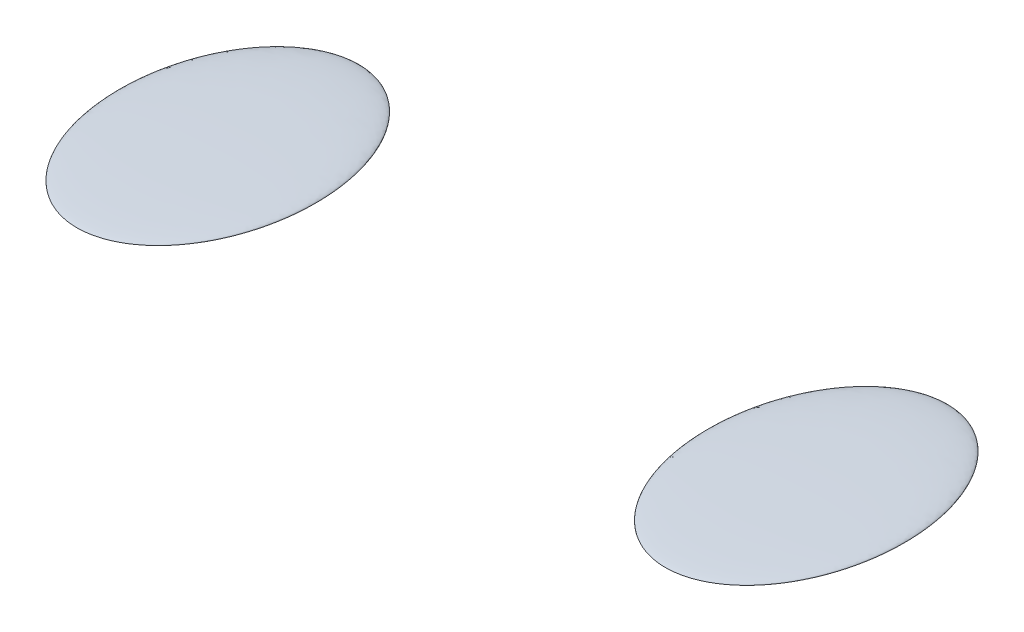
ISO-10303-21;
HEADER;
FILE_DESCRIPTION(('STEP AP214'),'2;1');
FILE_NAME('part.step','',(''),(''),'','','');
FILE_SCHEMA(('AUTOMOTIVE_DESIGN { 1 0 10303 214 1 1 1 1 }'));
ENDSEC;
DATA;
#1=APPLICATION_CONTEXT('core data for automotive mechanical design processes');
#2=APPLICATION_PROTOCOL_DEFINITION('international standard','automotive_design',2000,#1);
#3=PRODUCT_CONTEXT('',#1,'mechanical');
#4=PRODUCT('Part','Part','',(#3));
#5=PRODUCT_RELATED_PRODUCT_CATEGORY('part','',(#4));
#6=PRODUCT_DEFINITION_FORMATION('','',#4);
#7=PRODUCT_DEFINITION_CONTEXT('part definition',#1,'design');
#8=PRODUCT_DEFINITION('design','',#6,#7);
#9=PRODUCT_DEFINITION_SHAPE('','',#8);
#10=(LENGTH_UNIT() NAMED_UNIT(*) SI_UNIT(.MILLI.,.METRE.));
#11=(NAMED_UNIT(*) PLANE_ANGLE_UNIT() SI_UNIT($,.RADIAN.));
#12=(NAMED_UNIT(*) SI_UNIT($,.STERADIAN.) SOLID_ANGLE_UNIT());
#13=UNCERTAINTY_MEASURE_WITH_UNIT(LENGTH_MEASURE(1.E-05),#10,'distance_accuracy_value','');
#14=(GEOMETRIC_REPRESENTATION_CONTEXT(3) GLOBAL_UNCERTAINTY_ASSIGNED_CONTEXT((#13)) GLOBAL_UNIT_ASSIGNED_CONTEXT((#10,
#11,#12)) REPRESENTATION_CONTEXT('',''));
#15=CARTESIAN_POINT('',(0.,0.,0.));
#16=DIRECTION('',(0.,0.,1.));
#17=DIRECTION('',(1.,0.,0.));
#18=AXIS2_PLACEMENT_3D('',#15,#16,#17);
#19=CARTESIAN_POINT('',(-24.,-40.45,97.5));
#20=CARTESIAN_POINT('',(-16.,-40.45,97.5));
#21=CARTESIAN_POINT('',(-16.,-40.45,109.));
#22=CARTESIAN_POINT('',(-16.,-40.45,120.5));
#23=CARTESIAN_POINT('',(-24.,-40.45,120.5));
#24=CARTESIAN_POINT('',(-24.,-40.45,97.5));
#25=CARTESIAN_POINT('',(-16.,-39.497372055837,97.5));
#26=CARTESIAN_POINT('',(-16.,-39.497372055837,109.));
#27=CARTESIAN_POINT('',(-16.,-39.497372055837,120.5));
#28=CARTESIAN_POINT('',(-24.,-40.45,120.5));
#29=CARTESIAN_POINT('',(-24.,-40.45,97.5));
#30=CARTESIAN_POINT('',(-28.,-39.973686027919,97.5));
#31=CARTESIAN_POINT('',(-28.,-39.973686027919,109.));
#32=CARTESIAN_POINT('',(-28.,-39.973686027919,120.5));
#33=CARTESIAN_POINT('',(-24.,-40.45,120.5));
#34=CARTESIAN_POINT('',(-24.,-40.45,97.5));
#35=CARTESIAN_POINT('',(-40.,-40.45,97.5));
#36=CARTESIAN_POINT('',(-40.,-40.45,109.));
#37=CARTESIAN_POINT('',(-40.,-40.45,120.5));
#38=CARTESIAN_POINT('',(-24.,-40.45,120.5));
#39=CARTESIAN_POINT('',(-24.,-40.45,97.5));
#40=CARTESIAN_POINT('',(-28.,-40.926313972081,97.5));
#41=CARTESIAN_POINT('',(-28.,-40.926313972081,109.));
#42=CARTESIAN_POINT('',(-28.,-40.926313972081,120.5));
#43=CARTESIAN_POINT('',(-24.,-40.45,120.5));
#44=CARTESIAN_POINT('',(-24.,-40.45,97.5));
#45=CARTESIAN_POINT('',(-16.,-41.402627944163,97.5));
#46=CARTESIAN_POINT('',(-16.,-41.402627944163,109.));
#47=CARTESIAN_POINT('',(-16.,-41.402627944163,120.5));
#48=CARTESIAN_POINT('',(-24.,-40.45,120.5));
#49=CARTESIAN_POINT('',(-24.,-40.45,97.5));
#50=CARTESIAN_POINT('',(-16.,-40.45,97.5));
#51=CARTESIAN_POINT('',(-16.,-40.45,109.));
#52=CARTESIAN_POINT('',(-16.,-40.45,120.5));
#53=CARTESIAN_POINT('',(-24.,-40.45,120.5));
#54=(BOUNDED_SURFACE() B_SPLINE_SURFACE(2,2,((#19,#20,#21,#22,#23),(#24,#25,#26,#27,#28),(#29,
#30,#31,#32,#33),(#34,#35,#36,#37,#38),(#39,#40,#41,#42,#43),(#44,#45,#46,#47,#48),(#49,#50,#51,
#52,#53)),.UNSPECIFIED.,.T.,.F.,.F.) B_SPLINE_SURFACE_WITH_KNOTS((3,2,2,3),(3,2,3),(0.,
2.094395102393,4.188790204786,6.28318530718),(-1.570796326795,0.,1.570796326795),
.UNSPECIFIED.) GEOMETRIC_REPRESENTATION_ITEM() RATIONAL_B_SPLINE_SURFACE(((1.,0.707106781187,1.,
0.707106781187,1.),(0.5,0.353553390593,0.5,0.353553390593,0.5),(1.,0.707106781187,1.,
0.707106781187,1.),(0.5,0.353553390593,0.5,0.353553390593,0.5),(1.,0.707106781187,1.,
0.707106781187,1.),(0.5,0.353553390593,0.5,0.353553390593,0.5),(1.,0.707106781187,1.,
0.707106781187,1.))) REPRESENTATION_ITEM('') SURFACE());
#55=CARTESIAN_POINT('',(-24.,-40.45,120.5));
#56=VERTEX_POINT('',#55);
#57=VERTEX_LOOP('',#56);
#58=FACE_BOUND('',#57,.T.);
#59=CARTESIAN_POINT('',(-24.,-40.45,97.5));
#60=VERTEX_POINT('',#59);
#61=VERTEX_LOOP('',#60);
#62=FACE_BOUND('',#61,.T.);
#63=ADVANCED_FACE('P0_F15',(#58,#62),#54,.T.);
#64=CLOSED_SHELL('',(#63));
#65=MANIFOLD_SOLID_BREP('P0_B1',#64);
#66=CARTESIAN_POINT('',(24.,-40.45,97.5));
#67=CARTESIAN_POINT('',(32.,-40.45,97.5));
#68=CARTESIAN_POINT('',(32.,-40.45,109.));
#69=CARTESIAN_POINT('',(32.,-40.45,120.5));
#70=CARTESIAN_POINT('',(24.,-40.45,120.5));
#71=CARTESIAN_POINT('',(24.,-40.45,97.5));
#72=CARTESIAN_POINT('',(32.,-39.497372055837,97.5));
#73=CARTESIAN_POINT('',(32.,-39.497372055837,109.));
#74=CARTESIAN_POINT('',(32.,-39.497372055837,120.5));
#75=CARTESIAN_POINT('',(24.,-40.45,120.5));
#76=CARTESIAN_POINT('',(24.,-40.45,97.5));
#77=CARTESIAN_POINT('',(20.,-39.973686027919,97.5));
#78=CARTESIAN_POINT('',(20.,-39.973686027919,109.));
#79=CARTESIAN_POINT('',(20.,-39.973686027919,120.5));
#80=CARTESIAN_POINT('',(24.,-40.45,120.5));
#81=CARTESIAN_POINT('',(24.,-40.45,97.5));
#82=CARTESIAN_POINT('',(8.,-40.45,97.5));
#83=CARTESIAN_POINT('',(8.,-40.45,109.));
#84=CARTESIAN_POINT('',(8.,-40.45,120.5));
#85=CARTESIAN_POINT('',(24.,-40.45,120.5));
#86=CARTESIAN_POINT('',(24.,-40.45,97.5));
#87=CARTESIAN_POINT('',(20.,-40.926313972081,97.5));
#88=CARTESIAN_POINT('',(20.,-40.926313972081,109.));
#89=CARTESIAN_POINT('',(20.,-40.926313972081,120.5));
#90=CARTESIAN_POINT('',(24.,-40.45,120.5));
#91=CARTESIAN_POINT('',(24.,-40.45,97.5));
#92=CARTESIAN_POINT('',(32.,-41.402627944163,97.5));
#93=CARTESIAN_POINT('',(32.,-41.402627944163,109.));
#94=CARTESIAN_POINT('',(32.,-41.402627944163,120.5));
#95=CARTESIAN_POINT('',(24.,-40.45,120.5));
#96=CARTESIAN_POINT('',(24.,-40.45,97.5));
#97=CARTESIAN_POINT('',(32.,-40.45,97.5));
#98=CARTESIAN_POINT('',(32.,-40.45,109.));
#99=CARTESIAN_POINT('',(32.,-40.45,120.5));
#100=CARTESIAN_POINT('',(24.,-40.45,120.5));
#101=(BOUNDED_SURFACE() B_SPLINE_SURFACE(2,2,((#66,#67,#68,#69,#70),(#71,#72,#73,#74,#75),(#76,
#77,#78,#79,#80),(#81,#82,#83,#84,#85),(#86,#87,#88,#89,#90),(#91,#92,#93,#94,#95),(#96,#97,#98,
#99,#100)),.UNSPECIFIED.,.T.,.F.,.F.) B_SPLINE_SURFACE_WITH_KNOTS((3,2,2,3),(3,2,3),(0.,
2.094395102393,4.188790204786,6.28318530718),(-1.570796326795,0.,1.570796326795),
.UNSPECIFIED.) GEOMETRIC_REPRESENTATION_ITEM() RATIONAL_B_SPLINE_SURFACE(((1.,0.707106781187,1.,
0.707106781187,1.),(0.5,0.353553390593,0.5,0.353553390593,0.5),(1.,0.707106781187,1.,
0.707106781187,1.),(0.5,0.353553390593,0.5,0.353553390593,0.5),(1.,0.707106781187,1.,
0.707106781187,1.),(0.5,0.353553390593,0.5,0.353553390593,0.5),(1.,0.707106781187,1.,
0.707106781187,1.))) REPRESENTATION_ITEM('') SURFACE());
#102=CARTESIAN_POINT('',(24.,-40.45,120.5));
#103=VERTEX_POINT('',#102);
#104=VERTEX_LOOP('',#103);
#105=FACE_BOUND('',#104,.T.);
#106=CARTESIAN_POINT('',(24.,-40.45,97.5));
#107=VERTEX_POINT('',#106);
#108=VERTEX_LOOP('',#107);
#109=FACE_BOUND('',#108,.T.);
#110=ADVANCED_FACE('P1_F14',(#105,#109),#101,.T.);
#111=CLOSED_SHELL('',(#110));
#112=MANIFOLD_SOLID_BREP('P1_B1',#111);
#113=ADVANCED_BREP_SHAPE_REPRESENTATION('',(#18,#65,#112),#14);
#114=SHAPE_DEFINITION_REPRESENTATION(#9,#113);
ENDSEC;
END-ISO-10303-21;
